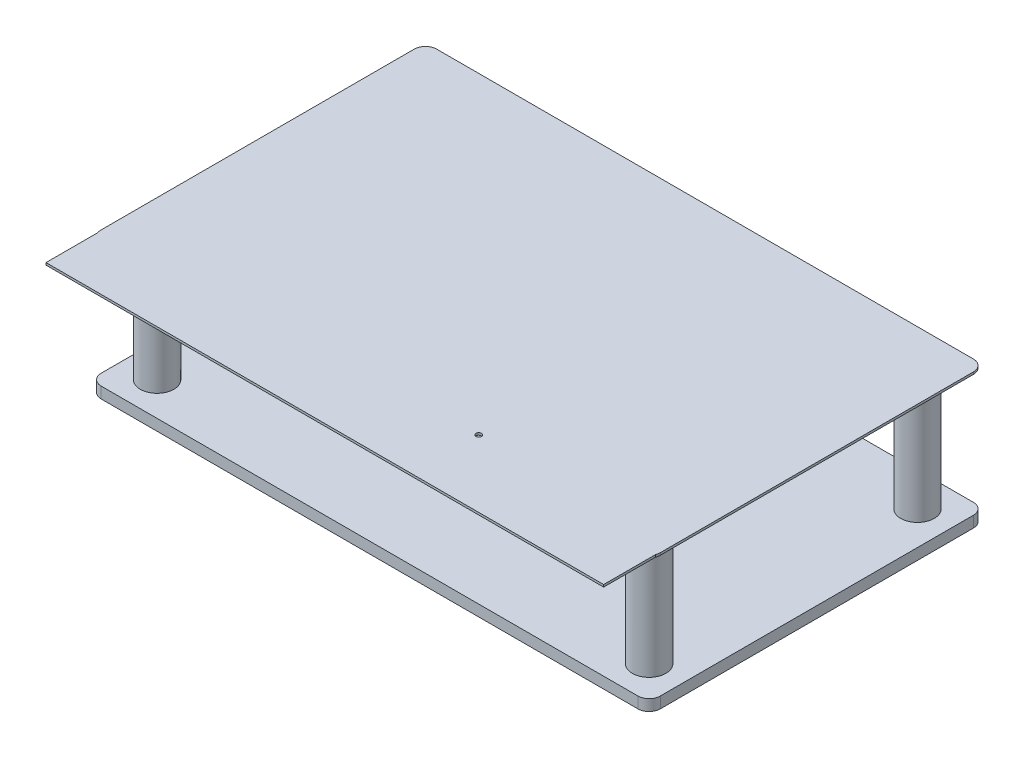
ISO-10303-21;
HEADER;
FILE_DESCRIPTION(('STEP AP214'),'2;1');
FILE_NAME('part.step','',(''),(''),'','','');
FILE_SCHEMA(('AUTOMOTIVE_DESIGN { 1 0 10303 214 1 1 1 1 }'));
ENDSEC;
DATA;
#1=APPLICATION_CONTEXT('core data for automotive mechanical design processes');
#2=APPLICATION_PROTOCOL_DEFINITION('international standard','automotive_design',2000,#1);
#3=PRODUCT_CONTEXT('',#1,'mechanical');
#4=PRODUCT('Part','Part','',(#3));
#5=PRODUCT_RELATED_PRODUCT_CATEGORY('part','',(#4));
#6=PRODUCT_DEFINITION_FORMATION('','',#4);
#7=PRODUCT_DEFINITION_CONTEXT('part definition',#1,'design');
#8=PRODUCT_DEFINITION('design','',#6,#7);
#9=PRODUCT_DEFINITION_SHAPE('','',#8);
#10=(LENGTH_UNIT() NAMED_UNIT(*) SI_UNIT(.MILLI.,.METRE.));
#11=(NAMED_UNIT(*) PLANE_ANGLE_UNIT() SI_UNIT($,.RADIAN.));
#12=(NAMED_UNIT(*) SI_UNIT($,.STERADIAN.) SOLID_ANGLE_UNIT());
#13=UNCERTAINTY_MEASURE_WITH_UNIT(LENGTH_MEASURE(1.E-05),#10,'distance_accuracy_value','');
#14=(GEOMETRIC_REPRESENTATION_CONTEXT(3) GLOBAL_UNCERTAINTY_ASSIGNED_CONTEXT((#13)) GLOBAL_UNIT_ASSIGNED_CONTEXT((#10,
#11,#12)) REPRESENTATION_CONTEXT('',''));
#15=CARTESIAN_POINT('',(0.,0.,0.));
#16=DIRECTION('',(0.,0.,1.));
#17=DIRECTION('',(1.,0.,0.));
#18=AXIS2_PLACEMENT_3D('',#15,#16,#17);
#19=CARTESIAN_POINT('',(240.,10.,-140.));
#20=DIRECTION('',(0.,-1.,0.));
#21=DIRECTION('',(0.,0.,-1.));
#22=AXIS2_PLACEMENT_3D('',#19,#20,#21);
#23=CYLINDRICAL_SURFACE('',#22,10.);
#24=CARTESIAN_POINT('',(240.,0.,-140.));
#25=DIRECTION('',(0.,1.,0.));
#26=DIRECTION('',(0.,0.,-1.));
#27=AXIS2_PLACEMENT_3D('',#24,#25,#26);
#28=CIRCLE('',#27,10.);
#29=CARTESIAN_POINT('',(250.,0.,-140.));
#30=VERTEX_POINT('',#29);
#31=CARTESIAN_POINT('',(240.,0.,-150.));
#32=VERTEX_POINT('',#31);
#33=EDGE_CURVE('E141',#30,#32,#28,.T.);
#34=ORIENTED_EDGE('',*,*,#33,.T.);
#35=DIRECTION('',(0.,-1.,0.));
#36=VECTOR('',#35,1.);
#37=CARTESIAN_POINT('',(240.,10.,-150.));
#38=LINE('',#37,#36);
#39=CARTESIAN_POINT('',(240.,10.,-150.));
#40=VERTEX_POINT('',#39);
#41=EDGE_CURVE('E169',#40,#32,#38,.T.);
#42=ORIENTED_EDGE('',*,*,#41,.F.);
#43=CARTESIAN_POINT('',(240.,10.,-140.));
#44=DIRECTION('',(0.,1.,0.));
#45=DIRECTION('',(0.,0.,-1.));
#46=AXIS2_PLACEMENT_3D('',#43,#44,#45);
#47=CIRCLE('',#46,10.);
#48=CARTESIAN_POINT('',(250.,10.,-140.));
#49=VERTEX_POINT('',#48);
#50=EDGE_CURVE('E156',#49,#40,#47,.T.);
#51=ORIENTED_EDGE('',*,*,#50,.F.);
#52=DIRECTION('',(0.,-1.,0.));
#53=VECTOR('',#52,1.);
#54=CARTESIAN_POINT('',(250.,10.,-140.));
#55=LINE('',#54,#53);
#56=EDGE_CURVE('E137',#49,#30,#55,.T.);
#57=ORIENTED_EDGE('',*,*,#56,.T.);
#58=EDGE_LOOP('',(#34,#42,#51,#57));
#59=FACE_BOUND('',#58,.T.);
#60=ADVANCED_FACE('F39',(#59),#23,.T.);
#61=CARTESIAN_POINT('',(-240.,10.,-150.));
#62=DIRECTION('',(0.,0.,1.));
#63=DIRECTION('',(1.,0.,0.));
#64=AXIS2_PLACEMENT_3D('',#61,#62,#63);
#65=PLANE('',#64);
#66=DIRECTION('',(-1.,0.,0.));
#67=VECTOR('',#66,1.);
#68=CARTESIAN_POINT('',(-240.,0.,-150.));
#69=LINE('',#68,#67);
#70=CARTESIAN_POINT('',(-240.,0.,-150.));
#71=VERTEX_POINT('',#70);
#72=EDGE_CURVE('E144',#32,#71,#69,.T.);
#73=ORIENTED_EDGE('',*,*,#72,.T.);
#74=DIRECTION('',(0.,-1.,0.));
#75=VECTOR('',#74,1.);
#76=CARTESIAN_POINT('',(-240.,10.,-150.));
#77=LINE('',#76,#75);
#78=CARTESIAN_POINT('',(-240.,10.,-150.));
#79=VERTEX_POINT('',#78);
#80=EDGE_CURVE('E166',#79,#71,#77,.T.);
#81=ORIENTED_EDGE('',*,*,#80,.F.);
#82=DIRECTION('',(-1.,0.,0.));
#83=VECTOR('',#82,1.);
#84=CARTESIAN_POINT('',(-240.,10.,-150.));
#85=LINE('',#84,#83);
#86=EDGE_CURVE('E101',#40,#79,#85,.T.);
#87=ORIENTED_EDGE('',*,*,#86,.F.);
#88=ORIENTED_EDGE('',*,*,#41,.T.);
#89=EDGE_LOOP('',(#73,#81,#87,#88));
#90=FACE_BOUND('',#89,.T.);
#91=ADVANCED_FACE('F207',(#90),#65,.F.);
#92=CARTESIAN_POINT('',(-240.,10.,-140.));
#93=DIRECTION('',(0.,-1.,0.));
#94=DIRECTION('',(0.,0.,-1.));
#95=AXIS2_PLACEMENT_3D('',#92,#93,#94);
#96=CYLINDRICAL_SURFACE('',#95,10.);
#97=CARTESIAN_POINT('',(-240.,0.,-140.));
#98=DIRECTION('',(0.,1.,0.));
#99=DIRECTION('',(0.,0.,1.));
#100=AXIS2_PLACEMENT_3D('',#97,#98,#99);
#101=CIRCLE('',#100,10.);
#102=CARTESIAN_POINT('',(-250.,0.,-140.));
#103=VERTEX_POINT('',#102);
#104=EDGE_CURVE('E147',#71,#103,#101,.T.);
#105=ORIENTED_EDGE('',*,*,#104,.T.);
#106=DIRECTION('',(0.,-1.,0.));
#107=VECTOR('',#106,1.);
#108=CARTESIAN_POINT('',(-250.,10.,-140.));
#109=LINE('',#108,#107);
#110=CARTESIAN_POINT('',(-250.,10.,-140.));
#111=VERTEX_POINT('',#110);
#112=EDGE_CURVE('E163',#111,#103,#109,.T.);
#113=ORIENTED_EDGE('',*,*,#112,.F.);
#114=CARTESIAN_POINT('',(-240.,10.,-140.));
#115=DIRECTION('',(0.,1.,0.));
#116=DIRECTION('',(0.,0.,1.));
#117=AXIS2_PLACEMENT_3D('',#114,#115,#116);
#118=CIRCLE('',#117,10.);
#119=EDGE_CURVE('E221',#79,#111,#118,.T.);
#120=ORIENTED_EDGE('',*,*,#119,.F.);
#121=ORIENTED_EDGE('',*,*,#80,.T.);
#122=EDGE_LOOP('',(#105,#113,#120,#121));
#123=FACE_BOUND('',#122,.T.);
#124=ADVANCED_FACE('F212',(#123),#96,.T.);
#125=CARTESIAN_POINT('',(-250.,10.,-140.));
#126=DIRECTION('',(1.,0.,0.));
#127=DIRECTION('',(0.,0.,-1.));
#128=AXIS2_PLACEMENT_3D('',#125,#126,#127);
#129=PLANE('',#128);
#130=DIRECTION('',(0.,0.,1.));
#131=VECTOR('',#130,1.);
#132=CARTESIAN_POINT('',(-250.,0.,-140.));
#133=LINE('',#132,#131);
#134=CARTESIAN_POINT('',(-250.,0.,140.));
#135=VERTEX_POINT('',#134);
#136=EDGE_CURVE('E149',#103,#135,#133,.T.);
#137=ORIENTED_EDGE('',*,*,#136,.T.);
#138=DIRECTION('',(0.,-1.,0.));
#139=VECTOR('',#138,1.);
#140=CARTESIAN_POINT('',(-250.,10.,140.));
#141=LINE('',#140,#139);
#142=CARTESIAN_POINT('',(-250.,10.,140.));
#143=VERTEX_POINT('',#142);
#144=EDGE_CURVE('E160',#143,#135,#141,.T.);
#145=ORIENTED_EDGE('',*,*,#144,.F.);
#146=DIRECTION('',(0.,0.,1.));
#147=VECTOR('',#146,1.);
#148=CARTESIAN_POINT('',(-250.,10.,-140.));
#149=LINE('',#148,#147);
#150=EDGE_CURVE('E223',#111,#143,#149,.T.);
#151=ORIENTED_EDGE('',*,*,#150,.F.);
#152=ORIENTED_EDGE('',*,*,#112,.T.);
#153=EDGE_LOOP('',(#137,#145,#151,#152));
#154=FACE_BOUND('',#153,.T.);
#155=ADVANCED_FACE('F544',(#154),#129,.F.);
#156=CARTESIAN_POINT('',(-240.,10.,140.));
#157=DIRECTION('',(0.,-1.,0.));
#158=DIRECTION('',(0.,0.,-1.));
#159=AXIS2_PLACEMENT_3D('',#156,#157,#158);
#160=CYLINDRICAL_SURFACE('',#159,10.);
#161=CARTESIAN_POINT('',(-240.,0.,140.));
#162=DIRECTION('',(0.,1.,0.));
#163=DIRECTION('',(0.,0.,1.));
#164=AXIS2_PLACEMENT_3D('',#161,#162,#163);
#165=CIRCLE('',#164,10.);
#166=CARTESIAN_POINT('',(-240.,0.,150.));
#167=VERTEX_POINT('',#166);
#168=EDGE_CURVE('E151',#135,#167,#165,.T.);
#169=ORIENTED_EDGE('',*,*,#168,.T.);
#170=DIRECTION('',(0.,-1.,0.));
#171=VECTOR('',#170,1.);
#172=CARTESIAN_POINT('',(-240.,10.,150.));
#173=LINE('',#172,#171);
#174=CARTESIAN_POINT('',(-240.,10.,150.));
#175=VERTEX_POINT('',#174);
#176=EDGE_CURVE('E132',#175,#167,#173,.T.);
#177=ORIENTED_EDGE('',*,*,#176,.F.);
#178=CARTESIAN_POINT('',(-240.,10.,140.));
#179=DIRECTION('',(0.,1.,0.));
#180=DIRECTION('',(0.,0.,1.));
#181=AXIS2_PLACEMENT_3D('',#178,#179,#180);
#182=CIRCLE('',#181,10.);
#183=EDGE_CURVE('E123',#143,#175,#182,.T.);
#184=ORIENTED_EDGE('',*,*,#183,.F.);
#185=ORIENTED_EDGE('',*,*,#144,.T.);
#186=EDGE_LOOP('',(#169,#177,#184,#185));
#187=FACE_BOUND('',#186,.T.);
#188=ADVANCED_FACE('F536',(#187),#160,.T.);
#189=CARTESIAN_POINT('',(-240.,10.,150.));
#190=DIRECTION('',(0.,0.,-1.));
#191=DIRECTION('',(-1.,0.,0.));
#192=AXIS2_PLACEMENT_3D('',#189,#190,#191);
#193=PLANE('',#192);
#194=DIRECTION('',(1.,0.,0.));
#195=VECTOR('',#194,1.);
#196=CARTESIAN_POINT('',(-240.,0.,150.));
#197=LINE('',#196,#195);
#198=CARTESIAN_POINT('',(240.,0.,150.));
#199=VERTEX_POINT('',#198);
#200=EDGE_CURVE('E131',#167,#199,#197,.T.);
#201=ORIENTED_EDGE('',*,*,#200,.T.);
#202=DIRECTION('',(0.,-1.,0.));
#203=VECTOR('',#202,1.);
#204=CARTESIAN_POINT('',(240.,10.,150.));
#205=LINE('',#204,#203);
#206=CARTESIAN_POINT('',(240.,10.,150.));
#207=VERTEX_POINT('',#206);
#208=EDGE_CURVE('E128',#207,#199,#205,.T.);
#209=ORIENTED_EDGE('',*,*,#208,.F.);
#210=DIRECTION('',(1.,0.,0.));
#211=VECTOR('',#210,1.);
#212=CARTESIAN_POINT('',(-240.,10.,150.));
#213=LINE('',#212,#211);
#214=EDGE_CURVE('E117',#175,#207,#213,.T.);
#215=ORIENTED_EDGE('',*,*,#214,.F.);
#216=ORIENTED_EDGE('',*,*,#176,.T.);
#217=EDGE_LOOP('',(#201,#209,#215,#216));
#218=FACE_BOUND('',#217,.T.);
#219=ADVANCED_FACE('F129',(#218),#193,.F.);
#220=CARTESIAN_POINT('',(240.,10.,140.));
#221=DIRECTION('',(0.,-1.,0.));
#222=DIRECTION('',(0.,0.,-1.));
#223=AXIS2_PLACEMENT_3D('',#220,#221,#222);
#224=CYLINDRICAL_SURFACE('',#223,10.);
#225=CARTESIAN_POINT('',(240.,0.,140.));
#226=DIRECTION('',(0.,1.,0.));
#227=DIRECTION('',(0.,0.,1.));
#228=AXIS2_PLACEMENT_3D('',#225,#226,#227);
#229=CIRCLE('',#228,10.);
#230=CARTESIAN_POINT('',(250.,0.,140.));
#231=VERTEX_POINT('',#230);
#232=EDGE_CURVE('E86',#199,#231,#229,.T.);
#233=ORIENTED_EDGE('',*,*,#232,.T.);
#234=DIRECTION('',(0.,-1.,0.));
#235=VECTOR('',#234,1.);
#236=CARTESIAN_POINT('',(250.,10.,140.));
#237=LINE('',#236,#235);
#238=CARTESIAN_POINT('',(250.,10.,140.));
#239=VERTEX_POINT('',#238);
#240=EDGE_CURVE('E133',#239,#231,#237,.T.);
#241=ORIENTED_EDGE('',*,*,#240,.F.);
#242=CARTESIAN_POINT('',(240.,10.,140.));
#243=DIRECTION('',(0.,1.,0.));
#244=DIRECTION('',(0.,0.,1.));
#245=AXIS2_PLACEMENT_3D('',#242,#243,#244);
#246=CIRCLE('',#245,10.);
#247=EDGE_CURVE('E121',#207,#239,#246,.T.);
#248=ORIENTED_EDGE('',*,*,#247,.F.);
#249=ORIENTED_EDGE('',*,*,#208,.T.);
#250=EDGE_LOOP('',(#233,#241,#248,#249));
#251=FACE_BOUND('',#250,.T.);
#252=ADVANCED_FACE('F135',(#251),#224,.T.);
#253=CARTESIAN_POINT('',(250.,10.,-140.));
#254=DIRECTION('',(-1.,0.,0.));
#255=DIRECTION('',(0.,0.,1.));
#256=AXIS2_PLACEMENT_3D('',#253,#254,#255);
#257=PLANE('',#256);
#258=DIRECTION('',(0.,0.,-1.));
#259=VECTOR('',#258,1.);
#260=CARTESIAN_POINT('',(250.,0.,-140.));
#261=LINE('',#260,#259);
#262=EDGE_CURVE('E92',#231,#30,#261,.T.);
#263=ORIENTED_EDGE('',*,*,#262,.T.);
#264=ORIENTED_EDGE('',*,*,#56,.F.);
#265=DIRECTION('',(0.,0.,-1.));
#266=VECTOR('',#265,1.);
#267=CARTESIAN_POINT('',(250.,10.,-140.));
#268=LINE('',#267,#266);
#269=EDGE_CURVE('E56',#239,#49,#268,.T.);
#270=ORIENTED_EDGE('',*,*,#269,.F.);
#271=ORIENTED_EDGE('',*,*,#240,.T.);
#272=EDGE_LOOP('',(#263,#264,#270,#271));
#273=FACE_BOUND('',#272,.T.);
#274=ADVANCED_FACE('F185',(#273),#257,.F.);
#275=CARTESIAN_POINT('',(240.,10.,-140.));
#276=DIRECTION('',(0.,-1.,0.));
#277=DIRECTION('',(0.,0.,-1.));
#278=AXIS2_PLACEMENT_3D('',#275,#276,#277);
#279=PLANE('',#278);
#280=CARTESIAN_POINT('',(-220.,9.99999999999999,120.));
#281=DIRECTION('',(0.,-1.,0.));
#282=DIRECTION('',(0.,0.,-1.));
#283=AXIS2_PLACEMENT_3D('',#280,#281,#282);
#284=CIRCLE('',#283,15.);
#285=CARTESIAN_POINT('',(-220.,9.99999999999999,105.));
#286=VERTEX_POINT('',#285);
#287=EDGE_CURVE('E11',#286,#286,#284,.F.);
#288=ORIENTED_EDGE('',*,*,#287,.F.);
#289=EDGE_LOOP('',(#288));
#290=FACE_BOUND('',#289,.T.);
#291=CARTESIAN_POINT('',(220.,9.99999999999999,120.));
#292=DIRECTION('',(0.,-1.,0.));
#293=DIRECTION('',(0.,0.,-1.));
#294=AXIS2_PLACEMENT_3D('',#291,#292,#293);
#295=CIRCLE('',#294,15.);
#296=CARTESIAN_POINT('',(220.,9.99999999999999,105.));
#297=VERTEX_POINT('',#296);
#298=EDGE_CURVE('E48',#297,#297,#295,.F.);
#299=ORIENTED_EDGE('',*,*,#298,.F.);
#300=EDGE_LOOP('',(#299));
#301=FACE_BOUND('',#300,.T.);
#302=CARTESIAN_POINT('',(220.,9.99999999999999,-120.));
#303=DIRECTION('',(0.,-1.,0.));
#304=DIRECTION('',(0.,0.,-1.));
#305=AXIS2_PLACEMENT_3D('',#302,#303,#304);
#306=CIRCLE('',#305,15.);
#307=CARTESIAN_POINT('',(220.,9.99999999999999,-135.));
#308=VERTEX_POINT('',#307);
#309=EDGE_CURVE('E174',#308,#308,#306,.F.);
#310=ORIENTED_EDGE('',*,*,#309,.F.);
#311=EDGE_LOOP('',(#310));
#312=FACE_BOUND('',#311,.T.);
#313=CARTESIAN_POINT('',(-220.,9.99999999999999,-120.));
#314=DIRECTION('',(0.,-1.,0.));
#315=DIRECTION('',(0.,0.,-1.));
#316=AXIS2_PLACEMENT_3D('',#313,#314,#315);
#317=CIRCLE('',#316,15.);
#318=CARTESIAN_POINT('',(-220.,9.99999999999999,-135.));
#319=VERTEX_POINT('',#318);
#320=EDGE_CURVE('E171',#319,#319,#317,.F.);
#321=ORIENTED_EDGE('',*,*,#320,.F.);
#322=EDGE_LOOP('',(#321));
#323=FACE_BOUND('',#322,.T.);
#324=ORIENTED_EDGE('',*,*,#50,.T.);
#325=ORIENTED_EDGE('',*,*,#86,.T.);
#326=ORIENTED_EDGE('',*,*,#119,.T.);
#327=ORIENTED_EDGE('',*,*,#150,.T.);
#328=ORIENTED_EDGE('',*,*,#183,.T.);
#329=ORIENTED_EDGE('',*,*,#214,.T.);
#330=ORIENTED_EDGE('',*,*,#247,.T.);
#331=ORIENTED_EDGE('',*,*,#269,.T.);
#332=EDGE_LOOP('',(#324,#325,#326,#327,#328,#329,#330,#331));
#333=FACE_BOUND('',#332,.T.);
#334=ADVANCED_FACE('F119',(#290,#301,#312,#323,#333),#279,.F.);
#335=CARTESIAN_POINT('',(240.,0.,-140.));
#336=DIRECTION('',(0.,-1.,0.));
#337=DIRECTION('',(0.,0.,-1.));
#338=AXIS2_PLACEMENT_3D('',#335,#336,#337);
#339=PLANE('',#338);
#340=ORIENTED_EDGE('',*,*,#33,.F.);
#341=ORIENTED_EDGE('',*,*,#262,.F.);
#342=ORIENTED_EDGE('',*,*,#232,.F.);
#343=ORIENTED_EDGE('',*,*,#200,.F.);
#344=ORIENTED_EDGE('',*,*,#168,.F.);
#345=ORIENTED_EDGE('',*,*,#136,.F.);
#346=ORIENTED_EDGE('',*,*,#104,.F.);
#347=ORIENTED_EDGE('',*,*,#72,.F.);
#348=EDGE_LOOP('',(#340,#341,#342,#343,#344,#345,#346,#347));
#349=FACE_BOUND('',#348,.T.);
#350=ADVANCED_FACE('F184',(#349),#339,.T.);
#351=CARTESIAN_POINT('',(-220.,119.,-120.));
#352=DIRECTION('',(0.,-1.,0.));
#353=DIRECTION('',(0.,0.,-1.));
#354=AXIS2_PLACEMENT_3D('',#351,#352,#353);
#355=CYLINDRICAL_SURFACE('',#354,15.);
#356=CARTESIAN_POINT('',(-220.,119.,-120.));
#357=DIRECTION('',(0.,1.,0.));
#358=DIRECTION('',(0.,0.,1.));
#359=AXIS2_PLACEMENT_3D('',#356,#357,#358);
#360=CIRCLE('',#359,15.);
#361=CARTESIAN_POINT('',(-220.,119.,-105.));
#362=VERTEX_POINT('',#361);
#363=EDGE_CURVE('E145',#362,#362,#360,.T.);
#364=ORIENTED_EDGE('',*,*,#363,.F.);
#365=EDGE_LOOP('',(#364));
#366=FACE_BOUND('',#365,.T.);
#367=ORIENTED_EDGE('',*,*,#320,.T.);
#368=EDGE_LOOP('',(#367));
#369=FACE_BOUND('',#368,.T.);
#370=ADVANCED_FACE('F192',(#366,#369),#355,.T.);
#371=CARTESIAN_POINT('',(220.,119.,-120.));
#372=DIRECTION('',(0.,-1.,0.));
#373=DIRECTION('',(0.,0.,-1.));
#374=AXIS2_PLACEMENT_3D('',#371,#372,#373);
#375=CYLINDRICAL_SURFACE('',#374,15.);
#376=CARTESIAN_POINT('',(220.,119.,-120.));
#377=DIRECTION('',(0.,1.,0.));
#378=DIRECTION('',(0.,0.,-1.));
#379=AXIS2_PLACEMENT_3D('',#376,#377,#378);
#380=CIRCLE('',#379,15.);
#381=CARTESIAN_POINT('',(220.,119.,-135.));
#382=VERTEX_POINT('',#381);
#383=EDGE_CURVE('E231',#382,#382,#380,.T.);
#384=ORIENTED_EDGE('',*,*,#383,.F.);
#385=EDGE_LOOP('',(#384));
#386=FACE_BOUND('',#385,.T.);
#387=ORIENTED_EDGE('',*,*,#309,.T.);
#388=EDGE_LOOP('',(#387));
#389=FACE_BOUND('',#388,.T.);
#390=ADVANCED_FACE('F194',(#386,#389),#375,.T.);
#391=CARTESIAN_POINT('',(220.,119.,120.));
#392=DIRECTION('',(0.,-1.,0.));
#393=DIRECTION('',(0.,0.,-1.));
#394=AXIS2_PLACEMENT_3D('',#391,#392,#393);
#395=CYLINDRICAL_SURFACE('',#394,15.);
#396=CARTESIAN_POINT('',(220.,119.,120.));
#397=DIRECTION('',(0.,1.,0.));
#398=DIRECTION('',(0.,0.,1.));
#399=AXIS2_PLACEMENT_3D('',#396,#397,#398);
#400=CIRCLE('',#399,15.);
#401=CARTESIAN_POINT('',(220.,119.,135.));
#402=VERTEX_POINT('',#401);
#403=EDGE_CURVE('E234',#402,#402,#400,.T.);
#404=ORIENTED_EDGE('',*,*,#403,.F.);
#405=EDGE_LOOP('',(#404));
#406=FACE_BOUND('',#405,.T.);
#407=ORIENTED_EDGE('',*,*,#298,.T.);
#408=EDGE_LOOP('',(#407));
#409=FACE_BOUND('',#408,.T.);
#410=ADVANCED_FACE('F180',(#406,#409),#395,.T.);
#411=CARTESIAN_POINT('',(-220.,119.,120.));
#412=DIRECTION('',(0.,-1.,0.));
#413=DIRECTION('',(0.,0.,-1.));
#414=AXIS2_PLACEMENT_3D('',#411,#412,#413);
#415=CYLINDRICAL_SURFACE('',#414,15.);
#416=CARTESIAN_POINT('',(-220.,119.,120.));
#417=DIRECTION('',(0.,1.,0.));
#418=DIRECTION('',(0.,0.,-1.));
#419=AXIS2_PLACEMENT_3D('',#416,#417,#418);
#420=CIRCLE('',#419,15.);
#421=CARTESIAN_POINT('',(-220.,119.,105.));
#422=VERTEX_POINT('',#421);
#423=EDGE_CURVE('E237',#422,#422,#420,.T.);
#424=ORIENTED_EDGE('',*,*,#423,.F.);
#425=EDGE_LOOP('',(#424));
#426=FACE_BOUND('',#425,.T.);
#427=ORIENTED_EDGE('',*,*,#287,.T.);
#428=EDGE_LOOP('',(#427));
#429=FACE_BOUND('',#428,.T.);
#430=ADVANCED_FACE('F391',(#426,#429),#415,.T.);
#431=CARTESIAN_POINT('',(240.,121.,140.));
#432=DIRECTION('',(0.,-1.,0.));
#433=DIRECTION('',(0.,0.,-1.));
#434=AXIS2_PLACEMENT_3D('',#431,#432,#433);
#435=CYLINDRICAL_SURFACE('',#434,10.);
#436=CARTESIAN_POINT('',(240.,121.,140.));
#437=DIRECTION('',(0.,1.,0.));
#438=DIRECTION('',(0.,0.,1.));
#439=AXIS2_PLACEMENT_3D('',#436,#437,#438);
#440=CIRCLE('',#439,10.);
#441=CARTESIAN_POINT('',(249.35038016701,121.,143.545474683647));
#442=VERTEX_POINT('',#441);
#443=CARTESIAN_POINT('',(250.,121.,140.));
#444=VERTEX_POINT('',#443);
#445=EDGE_CURVE('E262',#442,#444,#440,.T.);
#446=ORIENTED_EDGE('',*,*,#445,.F.);
#447=DIRECTION('',(0.,-1.,0.));
#448=VECTOR('',#447,1.);
#449=CARTESIAN_POINT('',(249.35038016701,121.,143.545474683647));
#450=LINE('',#449,#448);
#451=CARTESIAN_POINT('',(249.35038016701,119.,143.545474683647));
#452=VERTEX_POINT('',#451);
#453=EDGE_CURVE('E281',#442,#452,#450,.T.);
#454=ORIENTED_EDGE('',*,*,#453,.T.);
#455=CARTESIAN_POINT('',(240.,119.,140.));
#456=DIRECTION('',(0.,1.,0.));
#457=DIRECTION('',(0.,0.,1.));
#458=AXIS2_PLACEMENT_3D('',#455,#456,#457);
#459=CIRCLE('',#458,10.);
#460=CARTESIAN_POINT('',(250.,119.,140.));
#461=VERTEX_POINT('',#460);
#462=EDGE_CURVE('E278',#452,#461,#459,.T.);
#463=ORIENTED_EDGE('',*,*,#462,.T.);
#464=DIRECTION('',(0.,-1.,0.));
#465=VECTOR('',#464,1.);
#466=CARTESIAN_POINT('',(250.,121.,140.));
#467=LINE('',#466,#465);
#468=EDGE_CURVE('E240',#444,#461,#467,.T.);
#469=ORIENTED_EDGE('',*,*,#468,.F.);
#470=EDGE_LOOP('',(#446,#454,#463,#469));
#471=FACE_BOUND('',#470,.T.);
#472=ADVANCED_FACE('F387',(#471),#435,.T.);
#473=CARTESIAN_POINT('',(250.,121.,-140.));
#474=DIRECTION('',(-1.,0.,0.));
#475=DIRECTION('',(0.,0.,1.));
#476=AXIS2_PLACEMENT_3D('',#473,#474,#475);
#477=PLANE('',#476);
#478=DIRECTION('',(0.,0.,-1.));
#479=VECTOR('',#478,1.);
#480=CARTESIAN_POINT('',(250.,119.,-140.));
#481=LINE('',#480,#479);
#482=CARTESIAN_POINT('',(250.,119.,-140.));
#483=VERTEX_POINT('',#482);
#484=EDGE_CURVE('E275',#461,#483,#481,.T.);
#485=ORIENTED_EDGE('',*,*,#484,.T.);
#486=DIRECTION('',(0.,-1.,0.));
#487=VECTOR('',#486,1.);
#488=CARTESIAN_POINT('',(250.,121.,-140.));
#489=LINE('',#488,#487);
#490=CARTESIAN_POINT('',(250.,121.,-140.));
#491=VERTEX_POINT('',#490);
#492=EDGE_CURVE('E243',#491,#483,#489,.T.);
#493=ORIENTED_EDGE('',*,*,#492,.F.);
#494=DIRECTION('',(0.,0.,-1.));
#495=VECTOR('',#494,1.);
#496=CARTESIAN_POINT('',(250.,121.,-140.));
#497=LINE('',#496,#495);
#498=EDGE_CURVE('E296',#444,#491,#497,.T.);
#499=ORIENTED_EDGE('',*,*,#498,.F.);
#500=ORIENTED_EDGE('',*,*,#468,.T.);
#501=EDGE_LOOP('',(#485,#493,#499,#500));
#502=FACE_BOUND('',#501,.T.);
#503=ADVANCED_FACE('F383',(#502),#477,.F.);
#504=CARTESIAN_POINT('',(240.,121.,-140.));
#505=DIRECTION('',(0.,-1.,0.));
#506=DIRECTION('',(0.,0.,-1.));
#507=AXIS2_PLACEMENT_3D('',#504,#505,#506);
#508=CYLINDRICAL_SURFACE('',#507,10.);
#509=CARTESIAN_POINT('',(240.,119.,-140.));
#510=DIRECTION('',(0.,1.,0.));
#511=DIRECTION('',(0.,0.,-1.));
#512=AXIS2_PLACEMENT_3D('',#509,#510,#511);
#513=CIRCLE('',#512,10.);
#514=CARTESIAN_POINT('',(240.,119.,-150.));
#515=VERTEX_POINT('',#514);
#516=EDGE_CURVE('E272',#483,#515,#513,.T.);
#517=ORIENTED_EDGE('',*,*,#516,.T.);
#518=DIRECTION('',(0.,-1.,0.));
#519=VECTOR('',#518,1.);
#520=CARTESIAN_POINT('',(240.,121.,-150.));
#521=LINE('',#520,#519);
#522=CARTESIAN_POINT('',(240.,121.,-150.));
#523=VERTEX_POINT('',#522);
#524=EDGE_CURVE('E246',#523,#515,#521,.T.);
#525=ORIENTED_EDGE('',*,*,#524,.F.);
#526=CARTESIAN_POINT('',(240.,121.,-140.));
#527=DIRECTION('',(0.,1.,0.));
#528=DIRECTION('',(0.,0.,-1.));
#529=AXIS2_PLACEMENT_3D('',#526,#527,#528);
#530=CIRCLE('',#529,10.);
#531=EDGE_CURVE('E293',#491,#523,#530,.T.);
#532=ORIENTED_EDGE('',*,*,#531,.F.);
#533=ORIENTED_EDGE('',*,*,#492,.T.);
#534=EDGE_LOOP('',(#517,#525,#532,#533));
#535=FACE_BOUND('',#534,.T.);
#536=ADVANCED_FACE('F379',(#535),#508,.T.);
#537=CARTESIAN_POINT('',(-240.,121.,-150.));
#538=DIRECTION('',(0.,0.,1.));
#539=DIRECTION('',(1.,0.,0.));
#540=AXIS2_PLACEMENT_3D('',#537,#538,#539);
#541=PLANE('',#540);
#542=DIRECTION('',(-1.,0.,0.));
#543=VECTOR('',#542,1.);
#544=CARTESIAN_POINT('',(-240.,119.,-150.));
#545=LINE('',#544,#543);
#546=CARTESIAN_POINT('',(-240.,119.,-150.));
#547=VERTEX_POINT('',#546);
#548=EDGE_CURVE('E269',#515,#547,#545,.T.);
#549=ORIENTED_EDGE('',*,*,#548,.T.);
#550=DIRECTION('',(0.,-1.,0.));
#551=VECTOR('',#550,1.);
#552=CARTESIAN_POINT('',(-240.,121.,-150.));
#553=LINE('',#552,#551);
#554=CARTESIAN_POINT('',(-240.,121.,-150.));
#555=VERTEX_POINT('',#554);
#556=EDGE_CURVE('E249',#555,#547,#553,.T.);
#557=ORIENTED_EDGE('',*,*,#556,.F.);
#558=DIRECTION('',(-1.,0.,0.));
#559=VECTOR('',#558,1.);
#560=CARTESIAN_POINT('',(-240.,121.,-150.));
#561=LINE('',#560,#559);
#562=EDGE_CURVE('E290',#523,#555,#561,.T.);
#563=ORIENTED_EDGE('',*,*,#562,.F.);
#564=ORIENTED_EDGE('',*,*,#524,.T.);
#565=EDGE_LOOP('',(#549,#557,#563,#564));
#566=FACE_BOUND('',#565,.T.);
#567=ADVANCED_FACE('F375',(#566),#541,.F.);
#568=CARTESIAN_POINT('',(-240.,121.,-140.));
#569=DIRECTION('',(0.,-1.,0.));
#570=DIRECTION('',(0.,0.,-1.));
#571=AXIS2_PLACEMENT_3D('',#568,#569,#570);
#572=CYLINDRICAL_SURFACE('',#571,10.);
#573=CARTESIAN_POINT('',(-240.,119.,-140.));
#574=DIRECTION('',(0.,1.,0.));
#575=DIRECTION('',(0.,0.,1.));
#576=AXIS2_PLACEMENT_3D('',#573,#574,#575);
#577=CIRCLE('',#576,10.);
#578=CARTESIAN_POINT('',(-250.,119.,-140.));
#579=VERTEX_POINT('',#578);
#580=EDGE_CURVE('E266',#547,#579,#577,.T.);
#581=ORIENTED_EDGE('',*,*,#580,.T.);
#582=DIRECTION('',(0.,-1.,0.));
#583=VECTOR('',#582,1.);
#584=CARTESIAN_POINT('',(-250.,121.,-140.));
#585=LINE('',#584,#583);
#586=CARTESIAN_POINT('',(-250.,121.,-140.));
#587=VERTEX_POINT('',#586);
#588=EDGE_CURVE('E252',#587,#579,#585,.T.);
#589=ORIENTED_EDGE('',*,*,#588,.F.);
#590=CARTESIAN_POINT('',(-240.,121.,-140.));
#591=DIRECTION('',(0.,1.,0.));
#592=DIRECTION('',(0.,0.,1.));
#593=AXIS2_PLACEMENT_3D('',#590,#591,#592);
#594=CIRCLE('',#593,10.);
#595=EDGE_CURVE('E287',#555,#587,#594,.T.);
#596=ORIENTED_EDGE('',*,*,#595,.F.);
#597=ORIENTED_EDGE('',*,*,#556,.T.);
#598=EDGE_LOOP('',(#581,#589,#596,#597));
#599=FACE_BOUND('',#598,.T.);
#600=ADVANCED_FACE('F371',(#599),#572,.T.);
#601=CARTESIAN_POINT('',(-250.,121.,-140.));
#602=DIRECTION('',(1.,0.,0.));
#603=DIRECTION('',(0.,0.,-1.));
#604=AXIS2_PLACEMENT_3D('',#601,#602,#603);
#605=PLANE('',#604);
#606=DIRECTION('',(0.,0.,1.));
#607=VECTOR('',#606,1.);
#608=CARTESIAN_POINT('',(-250.,119.,-140.));
#609=LINE('',#608,#607);
#610=CARTESIAN_POINT('',(-250.,119.,140.));
#611=VERTEX_POINT('',#610);
#612=EDGE_CURVE('E263',#579,#611,#609,.T.);
#613=ORIENTED_EDGE('',*,*,#612,.T.);
#614=DIRECTION('',(0.,-1.,0.));
#615=VECTOR('',#614,1.);
#616=CARTESIAN_POINT('',(-250.,121.,140.));
#617=LINE('',#616,#615);
#618=CARTESIAN_POINT('',(-250.,121.,140.));
#619=VERTEX_POINT('',#618);
#620=EDGE_CURVE('E255',#619,#611,#617,.T.);
#621=ORIENTED_EDGE('',*,*,#620,.F.);
#622=DIRECTION('',(0.,0.,1.));
#623=VECTOR('',#622,1.);
#624=CARTESIAN_POINT('',(-250.,121.,-140.));
#625=LINE('',#624,#623);
#626=EDGE_CURVE('E284',#587,#619,#625,.T.);
#627=ORIENTED_EDGE('',*,*,#626,.F.);
#628=ORIENTED_EDGE('',*,*,#588,.T.);
#629=EDGE_LOOP('',(#613,#621,#627,#628));
#630=FACE_BOUND('',#629,.T.);
#631=ADVANCED_FACE('F367',(#630),#605,.F.);
#632=CARTESIAN_POINT('',(-240.,121.,140.));
#633=DIRECTION('',(0.,-1.,0.));
#634=DIRECTION('',(0.,0.,-1.));
#635=AXIS2_PLACEMENT_3D('',#632,#633,#634);
#636=CYLINDRICAL_SURFACE('',#635,10.);
#637=CARTESIAN_POINT('',(-240.,119.,140.));
#638=DIRECTION('',(0.,1.,0.));
#639=DIRECTION('',(0.,0.,1.));
#640=AXIS2_PLACEMENT_3D('',#637,#638,#639);
#641=CIRCLE('',#640,10.);
#642=CARTESIAN_POINT('',(-249.35038016701,119.,143.545474683648));
#643=VERTEX_POINT('',#642);
#644=EDGE_CURVE('E259',#611,#643,#641,.T.);
#645=ORIENTED_EDGE('',*,*,#644,.T.);
#646=DIRECTION('',(0.,-1.,0.));
#647=VECTOR('',#646,1.);
#648=CARTESIAN_POINT('',(-249.35038016701,121.,143.545474683648));
#649=LINE('',#648,#647);
#650=CARTESIAN_POINT('',(-249.35038016701,121.,143.545474683648));
#651=VERTEX_POINT('',#650);
#652=EDGE_CURVE('E303',#643,#651,#649,.F.);
#653=ORIENTED_EDGE('',*,*,#652,.T.);
#654=CARTESIAN_POINT('',(-240.,121.,140.));
#655=DIRECTION('',(0.,1.,0.));
#656=DIRECTION('',(0.,0.,1.));
#657=AXIS2_PLACEMENT_3D('',#654,#655,#656);
#658=CIRCLE('',#657,10.);
#659=EDGE_CURVE('E258',#619,#651,#658,.T.);
#660=ORIENTED_EDGE('',*,*,#659,.F.);
#661=ORIENTED_EDGE('',*,*,#620,.T.);
#662=EDGE_LOOP('',(#645,#653,#660,#661));
#663=FACE_BOUND('',#662,.T.);
#664=ADVANCED_FACE('F361',(#663),#636,.T.);
#665=CARTESIAN_POINT('',(240.,121.,140.));
#666=DIRECTION('',(0.,1.,0.));
#667=DIRECTION('',(0.,0.,1.));
#668=AXIS2_PLACEMENT_3D('',#665,#666,#667);
#669=PLANE('',#668);
#670=CARTESIAN_POINT('',(77.6303801670099,121.,130.));
#671=DIRECTION('',(0.,1.,0.));
#672=DIRECTION('',(0.,0.,1.));
#673=AXIS2_PLACEMENT_3D('',#670,#671,#672);
#674=CIRCLE('',#673,2.5);
#675=CARTESIAN_POINT('',(77.6303801670099,121.,132.5));
#676=VERTEX_POINT('',#675);
#677=EDGE_CURVE('E330',#676,#676,#674,.T.);
#678=ORIENTED_EDGE('',*,*,#677,.F.);
#679=EDGE_LOOP('',(#678));
#680=FACE_BOUND('',#679,.T.);
#681=DIRECTION('',(0.,0.,-1.));
#682=VECTOR('',#681,1.);
#683=CARTESIAN_POINT('',(249.35038016701,121.,110.));
#684=LINE('',#683,#682);
#685=CARTESIAN_POINT('',(249.35038016701,121.,190.));
#686=VERTEX_POINT('',#685);
#687=EDGE_CURVE('E320',#686,#442,#684,.T.);
#688=ORIENTED_EDGE('',*,*,#687,.T.);
#689=ORIENTED_EDGE('',*,*,#445,.T.);
#690=ORIENTED_EDGE('',*,*,#498,.T.);
#691=ORIENTED_EDGE('',*,*,#531,.T.);
#692=ORIENTED_EDGE('',*,*,#562,.T.);
#693=ORIENTED_EDGE('',*,*,#595,.T.);
#694=ORIENTED_EDGE('',*,*,#626,.T.);
#695=ORIENTED_EDGE('',*,*,#659,.T.);
#696=DIRECTION('',(0.,0.,1.));
#697=VECTOR('',#696,1.);
#698=CARTESIAN_POINT('',(-249.35038016701,121.,110.));
#699=LINE('',#698,#697);
#700=CARTESIAN_POINT('',(-249.35038016701,121.,190.));
#701=VERTEX_POINT('',#700);
#702=EDGE_CURVE('E317',#651,#701,#699,.T.);
#703=ORIENTED_EDGE('',*,*,#702,.T.);
#704=DIRECTION('',(1.,0.,0.));
#705=VECTOR('',#704,1.);
#706=CARTESIAN_POINT('',(-249.35038016701,121.,190.));
#707=LINE('',#706,#705);
#708=EDGE_CURVE('E313',#701,#686,#707,.T.);
#709=ORIENTED_EDGE('',*,*,#708,.T.);
#710=EDGE_LOOP('',(#688,#689,#690,#691,#692,#693,#694,#695,#703,#709));
#711=FACE_BOUND('',#710,.T.);
#712=ADVANCED_FACE('F358',(#680,#711),#669,.T.);
#713=CARTESIAN_POINT('',(240.,119.,140.));
#714=DIRECTION('',(0.,1.,0.));
#715=DIRECTION('',(0.,0.,1.));
#716=AXIS2_PLACEMENT_3D('',#713,#714,#715);
#717=PLANE('',#716);
#718=CARTESIAN_POINT('',(77.6303801670099,119.,130.));
#719=DIRECTION('',(0.,1.,0.));
#720=DIRECTION('',(0.,0.,1.));
#721=AXIS2_PLACEMENT_3D('',#718,#719,#720);
#722=CIRCLE('',#721,2.5);
#723=CARTESIAN_POINT('',(77.6303801670099,119.,132.5));
#724=VERTEX_POINT('',#723);
#725=EDGE_CURVE('E42',#724,#724,#722,.T.);
#726=ORIENTED_EDGE('',*,*,#725,.T.);
#727=EDGE_LOOP('',(#726));
#728=FACE_BOUND('',#727,.T.);
#729=ORIENTED_EDGE('',*,*,#462,.F.);
#730=DIRECTION('',(0.,0.,-1.));
#731=VECTOR('',#730,1.);
#732=CARTESIAN_POINT('',(249.35038016701,119.,110.));
#733=LINE('',#732,#731);
#734=CARTESIAN_POINT('',(249.35038016701,119.,190.));
#735=VERTEX_POINT('',#734);
#736=EDGE_CURVE('E316',#735,#452,#733,.T.);
#737=ORIENTED_EDGE('',*,*,#736,.F.);
#738=DIRECTION('',(1.,0.,0.));
#739=VECTOR('',#738,1.);
#740=CARTESIAN_POINT('',(-249.35038016701,119.,190.));
#741=LINE('',#740,#739);
#742=CARTESIAN_POINT('',(-249.35038016701,119.,190.));
#743=VERTEX_POINT('',#742);
#744=EDGE_CURVE('E310',#743,#735,#741,.T.);
#745=ORIENTED_EDGE('',*,*,#744,.F.);
#746=DIRECTION('',(0.,0.,1.));
#747=VECTOR('',#746,1.);
#748=CARTESIAN_POINT('',(-249.35038016701,119.,110.));
#749=LINE('',#748,#747);
#750=EDGE_CURVE('E325',#643,#743,#749,.T.);
#751=ORIENTED_EDGE('',*,*,#750,.F.);
#752=ORIENTED_EDGE('',*,*,#644,.F.);
#753=ORIENTED_EDGE('',*,*,#612,.F.);
#754=ORIENTED_EDGE('',*,*,#580,.F.);
#755=ORIENTED_EDGE('',*,*,#548,.F.);
#756=ORIENTED_EDGE('',*,*,#516,.F.);
#757=ORIENTED_EDGE('',*,*,#484,.F.);
#758=EDGE_LOOP('',(#729,#737,#745,#751,#752,#753,#754,#755,#756,#757));
#759=FACE_BOUND('',#758,.T.);
#760=ORIENTED_EDGE('',*,*,#403,.T.);
#761=EDGE_LOOP('',(#760));
#762=FACE_BOUND('',#761,.T.);
#763=ORIENTED_EDGE('',*,*,#423,.T.);
#764=EDGE_LOOP('',(#763));
#765=FACE_BOUND('',#764,.T.);
#766=ORIENTED_EDGE('',*,*,#363,.T.);
#767=EDGE_LOOP('',(#766));
#768=FACE_BOUND('',#767,.T.);
#769=ORIENTED_EDGE('',*,*,#383,.T.);
#770=EDGE_LOOP('',(#769));
#771=FACE_BOUND('',#770,.T.);
#772=ADVANCED_FACE('F337',(#728,#759,#762,#765,#768,#771),#717,.F.);
#773=CARTESIAN_POINT('',(249.35038016701,119.,110.));
#774=DIRECTION('',(1.,0.,0.));
#775=DIRECTION('',(0.,0.,-1.));
#776=AXIS2_PLACEMENT_3D('',#773,#774,#775);
#777=PLANE('',#776);
#778=ORIENTED_EDGE('',*,*,#453,.F.);
#779=ORIENTED_EDGE('',*,*,#687,.F.);
#780=DIRECTION('',(0.,1.,0.));
#781=VECTOR('',#780,1.);
#782=CARTESIAN_POINT('',(249.35038016701,119.,190.));
#783=LINE('',#782,#781);
#784=EDGE_CURVE('E306',#735,#686,#783,.T.);
#785=ORIENTED_EDGE('',*,*,#784,.F.);
#786=ORIENTED_EDGE('',*,*,#736,.T.);
#787=EDGE_LOOP('',(#778,#779,#785,#786));
#788=FACE_BOUND('',#787,.T.);
#789=ADVANCED_FACE('F353',(#788),#777,.T.);
#790=CARTESIAN_POINT('',(-249.35038016701,119.,110.));
#791=DIRECTION('',(-1.,0.,0.));
#792=DIRECTION('',(0.,0.,1.));
#793=AXIS2_PLACEMENT_3D('',#790,#791,#792);
#794=PLANE('',#793);
#795=ORIENTED_EDGE('',*,*,#652,.F.);
#796=ORIENTED_EDGE('',*,*,#750,.T.);
#797=DIRECTION('',(0.,1.,0.));
#798=VECTOR('',#797,1.);
#799=CARTESIAN_POINT('',(-249.35038016701,119.,190.));
#800=LINE('',#799,#798);
#801=EDGE_CURVE('E307',#743,#701,#800,.T.);
#802=ORIENTED_EDGE('',*,*,#801,.T.);
#803=ORIENTED_EDGE('',*,*,#702,.F.);
#804=EDGE_LOOP('',(#795,#796,#802,#803));
#805=FACE_BOUND('',#804,.T.);
#806=ADVANCED_FACE('F347',(#805),#794,.T.);
#807=CARTESIAN_POINT('',(-249.35038016701,119.,190.));
#808=DIRECTION('',(0.,0.,1.));
#809=DIRECTION('',(1.,0.,0.));
#810=AXIS2_PLACEMENT_3D('',#807,#808,#809);
#811=PLANE('',#810);
#812=ORIENTED_EDGE('',*,*,#708,.F.);
#813=ORIENTED_EDGE('',*,*,#801,.F.);
#814=ORIENTED_EDGE('',*,*,#744,.T.);
#815=ORIENTED_EDGE('',*,*,#784,.T.);
#816=EDGE_LOOP('',(#812,#813,#814,#815));
#817=FACE_BOUND('',#816,.T.);
#818=ADVANCED_FACE('F342',(#817),#811,.T.);
#819=CARTESIAN_POINT('',(77.6303801670099,101.,130.));
#820=DIRECTION('',(0.,1.,0.));
#821=DIRECTION('',(0.,0.,1.));
#822=AXIS2_PLACEMENT_3D('',#819,#820,#821);
#823=CYLINDRICAL_SURFACE('',#822,2.5);
#824=ORIENTED_EDGE('',*,*,#677,.T.);
#825=EDGE_LOOP('',(#824));
#826=FACE_BOUND('',#825,.T.);
#827=ORIENTED_EDGE('',*,*,#725,.F.);
#828=EDGE_LOOP('',(#827));
#829=FACE_BOUND('',#828,.T.);
#830=ADVANCED_FACE('F340',(#826,#829),#823,.F.);
#831=CLOSED_SHELL('',(#60,#91,#124,#155,#188,#219,#252,#274,#334,#350,#370,#390,#410,#430,#472,
#503,#536,#567,#600,#631,#664,#712,#772,#789,#806,#818,#830));
#832=MANIFOLD_SOLID_BREP('B2',#831);
#833=ADVANCED_BREP_SHAPE_REPRESENTATION('',(#18,#832),#14);
#834=SHAPE_DEFINITION_REPRESENTATION(#9,#833);
ENDSEC;
END-ISO-10303-21;
